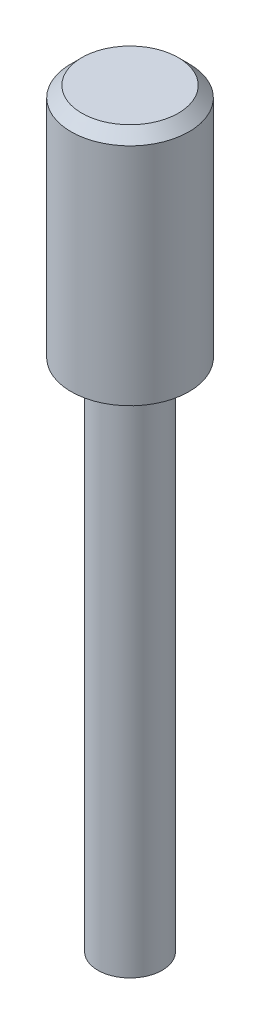
ISO-10303-21;
HEADER;
FILE_DESCRIPTION(('STEP AP214'),'2;1');
FILE_NAME('part.step','',(''),(''),'','','');
FILE_SCHEMA(('AUTOMOTIVE_DESIGN { 1 0 10303 214 1 1 1 1 }'));
ENDSEC;
DATA;
#1=APPLICATION_CONTEXT('core data for automotive mechanical design processes');
#2=APPLICATION_PROTOCOL_DEFINITION('international standard','automotive_design',2000,#1);
#3=PRODUCT_CONTEXT('',#1,'mechanical');
#4=PRODUCT('Part','Part','',(#3));
#5=PRODUCT_RELATED_PRODUCT_CATEGORY('part','',(#4));
#6=PRODUCT_DEFINITION_FORMATION('','',#4);
#7=PRODUCT_DEFINITION_CONTEXT('part definition',#1,'design');
#8=PRODUCT_DEFINITION('design','',#6,#7);
#9=PRODUCT_DEFINITION_SHAPE('','',#8);
#10=(LENGTH_UNIT() NAMED_UNIT(*) SI_UNIT(.MILLI.,.METRE.));
#11=(NAMED_UNIT(*) PLANE_ANGLE_UNIT() SI_UNIT($,.RADIAN.));
#12=(NAMED_UNIT(*) SI_UNIT($,.STERADIAN.) SOLID_ANGLE_UNIT());
#13=UNCERTAINTY_MEASURE_WITH_UNIT(LENGTH_MEASURE(1.E-05),#10,'distance_accuracy_value','');
#14=(GEOMETRIC_REPRESENTATION_CONTEXT(3) GLOBAL_UNCERTAINTY_ASSIGNED_CONTEXT((#13)) GLOBAL_UNIT_ASSIGNED_CONTEXT((#10,
#11,#12)) REPRESENTATION_CONTEXT('',''));
#15=CARTESIAN_POINT('',(0.,0.,0.));
#16=DIRECTION('',(0.,0.,1.));
#17=DIRECTION('',(1.,0.,0.));
#18=AXIS2_PLACEMENT_3D('',#15,#16,#17);
#19=CARTESIAN_POINT('',(1.36651799903222,-54.2500000000001,-18.8524911745676));
#20=DIRECTION('',(0.,1.,0.));
#21=DIRECTION('',(0.,0.,1.));
#22=AXIS2_PLACEMENT_3D('',#19,#20,#21);
#23=PLANE('',#22);
#24=CARTESIAN_POINT('',(0.,-54.2499999966508,-18.7));
#25=DIRECTION('',(0.,-1.,0.));
#26=DIRECTION('',(1.,0.,0.));
#27=AXIS2_PLACEMENT_3D('',#24,#25,#26);
#28=CIRCLE('',#27,2.25000000334937);
#29=CARTESIAN_POINT('',(2.25000000334938,-54.2499999966508,-18.7));
#30=VERTEX_POINT('',#29);
#31=EDGE_CURVE('E18',#30,#30,#28,.T.);
#32=ORIENTED_EDGE('',*,*,#31,.F.);
#33=EDGE_LOOP('',(#32));
#34=FACE_BOUND('',#33,.T.);
#35=ADVANCED_FACE('F15',(#34),#23,.T.);
#36=CARTESIAN_POINT('',(0.,-54.2499999966508,-18.7));
#37=DIRECTION('',(0.,-1.,0.));
#38=DIRECTION('',(1.,0.,0.));
#39=AXIS2_PLACEMENT_3D('',#36,#37,#38);
#40=CONICAL_SURFACE('',#39,2.25000000334937,0.785398150000001);
#41=ORIENTED_EDGE('',*,*,#31,.T.);
#42=EDGE_LOOP('',(#41));
#43=FACE_BOUND('',#42,.T.);
#44=CARTESIAN_POINT('',(0.,-54.7500000000001,-18.7));
#45=DIRECTION('',(0.,-1.,0.));
#46=DIRECTION('',(0.993831272023426,0.,-0.110902672412795));
#47=AXIS2_PLACEMENT_3D('',#44,#45,#46);
#48=CIRCLE('',#47,2.75);
#49=CARTESIAN_POINT('',(2.73303599806443,-54.7500000000001,-19.0049823491352));
#50=VERTEX_POINT('',#49);
#51=EDGE_CURVE('E30',#50,#50,#48,.T.);
#52=ORIENTED_EDGE('',*,*,#51,.F.);
#53=EDGE_LOOP('',(#52));
#54=FACE_BOUND('',#53,.T.);
#55=ADVANCED_FACE('F40',(#43,#54),#40,.T.);
#56=CARTESIAN_POINT('',(0.,-54.7500000000001,-18.7));
#57=DIRECTION('',(0.,-1.,0.));
#58=DIRECTION('',(1.,0.,0.));
#59=AXIS2_PLACEMENT_3D('',#56,#57,#58);
#60=CYLINDRICAL_SURFACE('',#59,2.75);
#61=CARTESIAN_POINT('',(0.,-65.2500000000001,-18.7));
#62=DIRECTION('',(0.,-1.,0.));
#63=DIRECTION('',(1.,0.,0.));
#64=AXIS2_PLACEMENT_3D('',#61,#62,#63);
#65=CIRCLE('',#64,2.75);
#66=CARTESIAN_POINT('',(2.74999999999999,-65.2500000000001,-18.7));
#67=VERTEX_POINT('',#66);
#68=EDGE_CURVE('E27',#67,#67,#65,.T.);
#69=ORIENTED_EDGE('',*,*,#68,.F.);
#70=EDGE_LOOP('',(#69));
#71=FACE_BOUND('',#70,.T.);
#72=ORIENTED_EDGE('',*,*,#51,.T.);
#73=EDGE_LOOP('',(#72));
#74=FACE_BOUND('',#73,.T.);
#75=ADVANCED_FACE('F48',(#71,#74),#60,.T.);
#76=CARTESIAN_POINT('',(0.745373454017509,-89.2500000000001,-18.7831770043096));
#77=DIRECTION('',(0.,-1.,0.));
#78=DIRECTION('',(0.,0.,-1.));
#79=AXIS2_PLACEMENT_3D('',#76,#77,#78);
#80=PLANE('',#79);
#81=CARTESIAN_POINT('',(0.,-89.2500000000001,-18.7));
#82=DIRECTION('',(0.,-1.,0.));
#83=DIRECTION('',(1.,0.,0.));
#84=AXIS2_PLACEMENT_3D('',#81,#82,#83);
#85=CIRCLE('',#84,1.5);
#86=CARTESIAN_POINT('',(1.49999999999994,-89.2500000000001,-18.7));
#87=VERTEX_POINT('',#86);
#88=EDGE_CURVE('E22',#87,#87,#85,.F.);
#89=ORIENTED_EDGE('',*,*,#88,.F.);
#90=EDGE_LOOP('',(#89));
#91=FACE_BOUND('',#90,.T.);
#92=ADVANCED_FACE('F57',(#91),#80,.T.);
#93=CARTESIAN_POINT('',(2.11189145304977,-65.2500000000001,-18.9356681788772));
#94=DIRECTION('',(0.,-1.,0.));
#95=DIRECTION('',(0.,0.,-1.));
#96=AXIS2_PLACEMENT_3D('',#93,#94,#95);
#97=PLANE('',#96);
#98=CARTESIAN_POINT('',(0.,-65.2500000000001,-18.7));
#99=DIRECTION('',(0.,-1.,0.));
#100=DIRECTION('',(1.,0.,0.));
#101=AXIS2_PLACEMENT_3D('',#98,#99,#100);
#102=CIRCLE('',#101,1.5);
#103=CARTESIAN_POINT('',(1.49999999999999,-65.2500000000001,-18.7));
#104=VERTEX_POINT('',#103);
#105=EDGE_CURVE('E10',#104,#104,#102,.T.);
#106=ORIENTED_EDGE('',*,*,#105,.F.);
#107=EDGE_LOOP('',(#106));
#108=FACE_BOUND('',#107,.T.);
#109=ORIENTED_EDGE('',*,*,#68,.T.);
#110=EDGE_LOOP('',(#109));
#111=FACE_BOUND('',#110,.T.);
#112=ADVANCED_FACE('F51',(#108,#111),#97,.T.);
#113=CARTESIAN_POINT('',(0.,-65.2500000000001,-18.7));
#114=DIRECTION('',(0.,-1.,0.));
#115=DIRECTION('',(1.,0.,0.));
#116=AXIS2_PLACEMENT_3D('',#113,#114,#115);
#117=CYLINDRICAL_SURFACE('',#116,1.5);
#118=ORIENTED_EDGE('',*,*,#88,.T.);
#119=EDGE_LOOP('',(#118));
#120=FACE_BOUND('',#119,.T.);
#121=ORIENTED_EDGE('',*,*,#105,.T.);
#122=EDGE_LOOP('',(#121));
#123=FACE_BOUND('',#122,.T.);
#124=ADVANCED_FACE('F49',(#120,#123),#117,.T.);
#125=CLOSED_SHELL('',(#35,#55,#75,#92,#112,#124));
#126=MANIFOLD_SOLID_BREP('B1',#125);
#127=ADVANCED_BREP_SHAPE_REPRESENTATION('',(#18,#126),#14);
#128=SHAPE_DEFINITION_REPRESENTATION(#9,#127);
ENDSEC;
END-ISO-10303-21;
